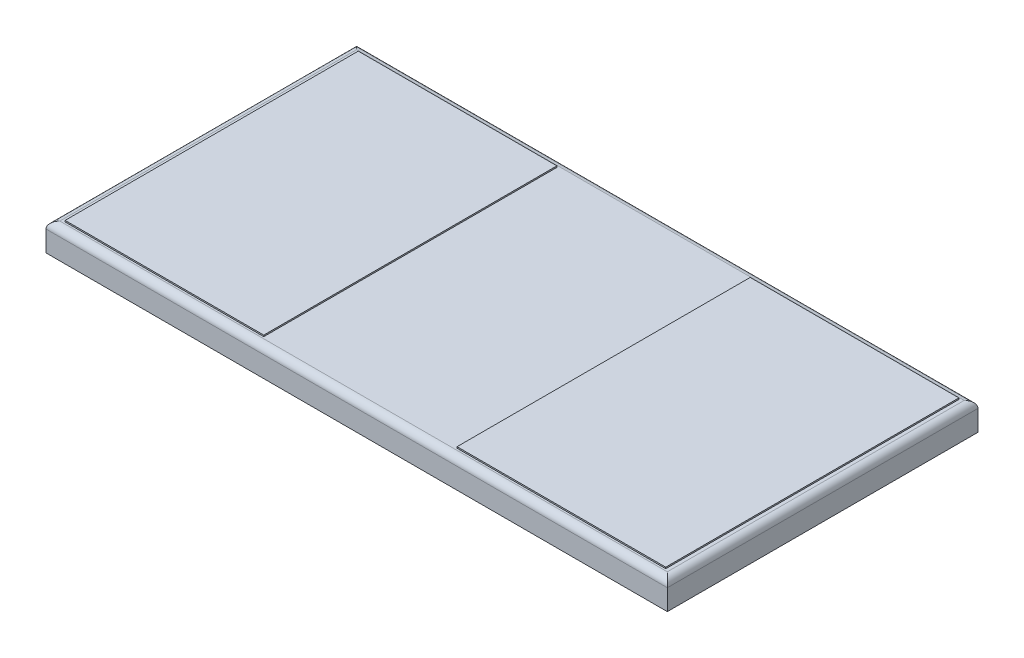
ISO-10303-21;
HEADER;
FILE_DESCRIPTION(('STEP AP214'),'2;1');
FILE_NAME('part.step','',(''),(''),'','','');
FILE_SCHEMA(('AUTOMOTIVE_DESIGN { 1 0 10303 214 1 1 1 1 }'));
ENDSEC;
DATA;
#1=APPLICATION_CONTEXT('core data for automotive mechanical design processes');
#2=APPLICATION_PROTOCOL_DEFINITION('international standard','automotive_design',2000,#1);
#3=PRODUCT_CONTEXT('',#1,'mechanical');
#4=PRODUCT('Part','Part','',(#3));
#5=PRODUCT_RELATED_PRODUCT_CATEGORY('part','',(#4));
#6=PRODUCT_DEFINITION_FORMATION('','',#4);
#7=PRODUCT_DEFINITION_CONTEXT('part definition',#1,'design');
#8=PRODUCT_DEFINITION('design','',#6,#7);
#9=PRODUCT_DEFINITION_SHAPE('','',#8);
#10=(LENGTH_UNIT() NAMED_UNIT(*) SI_UNIT(.MILLI.,.METRE.));
#11=(NAMED_UNIT(*) PLANE_ANGLE_UNIT() SI_UNIT($,.RADIAN.));
#12=(NAMED_UNIT(*) SI_UNIT($,.STERADIAN.) SOLID_ANGLE_UNIT());
#13=UNCERTAINTY_MEASURE_WITH_UNIT(LENGTH_MEASURE(1.E-05),#10,'distance_accuracy_value','');
#14=(GEOMETRIC_REPRESENTATION_CONTEXT(3) GLOBAL_UNCERTAINTY_ASSIGNED_CONTEXT((#13)) GLOBAL_UNIT_ASSIGNED_CONTEXT((#10,
#11,#12)) REPRESENTATION_CONTEXT('',''));
#15=CARTESIAN_POINT('',(0.,0.,0.));
#16=DIRECTION('',(0.,0.,1.));
#17=DIRECTION('',(1.,0.,0.));
#18=AXIS2_PLACEMENT_3D('',#15,#16,#17);
#19=CARTESIAN_POINT('',(0.,101.6,0.));
#20=DIRECTION('',(1.,0.,0.));
#21=DIRECTION('',(0.,0.,-1.));
#22=AXIS2_PLACEMENT_3D('',#19,#20,#21);
#23=PLANE('',#22);
#24=DIRECTION('',(0.,-1.,0.));
#25=VECTOR('',#24,1.);
#26=CARTESIAN_POINT('',(0.,101.6,0.));
#27=LINE('',#26,#25);
#28=CARTESIAN_POINT('',(0.,76.2,0.));
#29=VERTEX_POINT('',#28);
#30=CARTESIAN_POINT('',(0.,0.,0.));
#31=VERTEX_POINT('',#30);
#32=EDGE_CURVE('E257',#29,#31,#27,.T.);
#33=ORIENTED_EDGE('',*,*,#32,.F.);
#34=DIRECTION('',(0.,0.,1.));
#35=VECTOR('',#34,1.);
#36=CARTESIAN_POINT('',(0.,76.2,0.));
#37=LINE('',#36,#35);
#38=CARTESIAN_POINT('',(0.,76.2,-1143.));
#39=VERTEX_POINT('',#38);
#40=EDGE_CURVE('E11',#29,#39,#37,.F.);
#41=ORIENTED_EDGE('',*,*,#40,.T.);
#42=DIRECTION('',(0.,-1.,0.));
#43=VECTOR('',#42,1.);
#44=CARTESIAN_POINT('',(0.,101.6,-1143.));
#45=LINE('',#44,#43);
#46=CARTESIAN_POINT('',(0.,0.,-1143.));
#47=VERTEX_POINT('',#46);
#48=EDGE_CURVE('E248',#39,#47,#45,.T.);
#49=ORIENTED_EDGE('',*,*,#48,.T.);
#50=DIRECTION('',(0.,0.,1.));
#51=VECTOR('',#50,1.);
#52=CARTESIAN_POINT('',(0.,0.,0.));
#53=LINE('',#52,#51);
#54=EDGE_CURVE('E220',#47,#31,#53,.T.);
#55=ORIENTED_EDGE('',*,*,#54,.T.);
#56=EDGE_LOOP('',(#33,#41,#49,#55));
#57=FACE_BOUND('',#56,.T.);
#58=ADVANCED_FACE('F39',(#57),#23,.F.);
#59=CARTESIAN_POINT('',(0.,101.6,0.));
#60=DIRECTION('',(0.,0.,-1.));
#61=DIRECTION('',(-1.,0.,0.));
#62=AXIS2_PLACEMENT_3D('',#59,#60,#61);
#63=PLANE('',#62);
#64=DIRECTION('',(0.,-1.,0.));
#65=VECTOR('',#64,1.);
#66=CARTESIAN_POINT('',(2286.,101.6,0.));
#67=LINE('',#66,#65);
#68=CARTESIAN_POINT('',(2286.,76.2,0.));
#69=VERTEX_POINT('',#68);
#70=CARTESIAN_POINT('',(2286.,0.,0.));
#71=VERTEX_POINT('',#70);
#72=EDGE_CURVE('E254',#69,#71,#67,.T.);
#73=ORIENTED_EDGE('',*,*,#72,.F.);
#74=DIRECTION('',(1.,0.,0.));
#75=VECTOR('',#74,1.);
#76=CARTESIAN_POINT('',(0.,76.2,0.));
#77=LINE('',#76,#75);
#78=EDGE_CURVE('E273',#69,#29,#77,.F.);
#79=ORIENTED_EDGE('',*,*,#78,.T.);
#80=ORIENTED_EDGE('',*,*,#32,.T.);
#81=DIRECTION('',(1.,0.,0.));
#82=VECTOR('',#81,1.);
#83=CARTESIAN_POINT('',(0.,0.,0.));
#84=LINE('',#83,#82);
#85=EDGE_CURVE('E236',#31,#71,#84,.T.);
#86=ORIENTED_EDGE('',*,*,#85,.T.);
#87=EDGE_LOOP('',(#73,#79,#80,#86));
#88=FACE_BOUND('',#87,.T.);
#89=ADVANCED_FACE('F310',(#88),#63,.F.);
#90=CARTESIAN_POINT('',(2286.,101.6,0.));
#91=DIRECTION('',(-1.,0.,0.));
#92=DIRECTION('',(0.,0.,1.));
#93=AXIS2_PLACEMENT_3D('',#90,#91,#92);
#94=PLANE('',#93);
#95=DIRECTION('',(0.,-1.,0.));
#96=VECTOR('',#95,1.);
#97=CARTESIAN_POINT('',(2286.,101.6,-1143.));
#98=LINE('',#97,#96);
#99=CARTESIAN_POINT('',(2286.,76.2,-1143.));
#100=VERTEX_POINT('',#99);
#101=CARTESIAN_POINT('',(2286.,0.,-1143.));
#102=VERTEX_POINT('',#101);
#103=EDGE_CURVE('E251',#100,#102,#98,.T.);
#104=ORIENTED_EDGE('',*,*,#103,.F.);
#105=DIRECTION('',(0.,0.,-1.));
#106=VECTOR('',#105,1.);
#107=CARTESIAN_POINT('',(2286.,76.2,0.));
#108=LINE('',#107,#106);
#109=EDGE_CURVE('E277',#100,#69,#108,.F.);
#110=ORIENTED_EDGE('',*,*,#109,.T.);
#111=ORIENTED_EDGE('',*,*,#72,.T.);
#112=DIRECTION('',(0.,0.,-1.));
#113=VECTOR('',#112,1.);
#114=CARTESIAN_POINT('',(2286.,0.,0.));
#115=LINE('',#114,#113);
#116=EDGE_CURVE('E240',#71,#102,#115,.T.);
#117=ORIENTED_EDGE('',*,*,#116,.T.);
#118=EDGE_LOOP('',(#104,#110,#111,#117));
#119=FACE_BOUND('',#118,.T.);
#120=ADVANCED_FACE('F307',(#119),#94,.F.);
#121=CARTESIAN_POINT('',(0.,101.6,-1143.));
#122=DIRECTION('',(0.,0.,1.));
#123=DIRECTION('',(1.,0.,0.));
#124=AXIS2_PLACEMENT_3D('',#121,#122,#123);
#125=PLANE('',#124);
#126=ORIENTED_EDGE('',*,*,#48,.F.);
#127=DIRECTION('',(-1.,0.,0.));
#128=VECTOR('',#127,1.);
#129=CARTESIAN_POINT('',(0.,76.2,-1143.));
#130=LINE('',#129,#128);
#131=EDGE_CURVE('E49',#39,#100,#130,.F.);
#132=ORIENTED_EDGE('',*,*,#131,.T.);
#133=ORIENTED_EDGE('',*,*,#103,.T.);
#134=DIRECTION('',(-1.,0.,0.));
#135=VECTOR('',#134,1.);
#136=CARTESIAN_POINT('',(0.,0.,-1143.));
#137=LINE('',#136,#135);
#138=EDGE_CURVE('E244',#102,#47,#137,.T.);
#139=ORIENTED_EDGE('',*,*,#138,.T.);
#140=EDGE_LOOP('',(#126,#132,#133,#139));
#141=FACE_BOUND('',#140,.T.);
#142=ADVANCED_FACE('F321',(#141),#125,.F.);
#143=CARTESIAN_POINT('',(0.,101.6,0.));
#144=DIRECTION('',(0.,-1.,0.));
#145=DIRECTION('',(0.,0.,-1.));
#146=AXIS2_PLACEMENT_3D('',#143,#144,#145);
#147=PLANE('',#146);
#148=DIRECTION('',(0.,0.,1.));
#149=VECTOR('',#148,1.);
#150=CARTESIAN_POINT('',(25.4,101.6,0.));
#151=LINE('',#150,#149);
#152=CARTESIAN_POINT('',(25.4,101.6,-1117.6));
#153=VERTEX_POINT('',#152);
#154=CARTESIAN_POINT('',(25.4,101.6,-25.4));
#155=VERTEX_POINT('',#154);
#156=EDGE_CURVE('E260',#153,#155,#151,.T.);
#157=ORIENTED_EDGE('',*,*,#156,.T.);
#158=DIRECTION('',(1.,0.,0.));
#159=VECTOR('',#158,1.);
#160=CARTESIAN_POINT('',(0.,101.6,-25.4));
#161=LINE('',#160,#159);
#162=CARTESIAN_POINT('',(2260.6,101.6,-25.4));
#163=VERTEX_POINT('',#162);
#164=EDGE_CURVE('E269',#155,#163,#161,.T.);
#165=ORIENTED_EDGE('',*,*,#164,.T.);
#166=DIRECTION('',(0.,0.,-1.));
#167=VECTOR('',#166,1.);
#168=CARTESIAN_POINT('',(2260.6,101.6,0.));
#169=LINE('',#168,#167);
#170=CARTESIAN_POINT('',(2260.6,101.6,-1117.6));
#171=VERTEX_POINT('',#170);
#172=EDGE_CURVE('E266',#163,#171,#169,.T.);
#173=ORIENTED_EDGE('',*,*,#172,.T.);
#174=DIRECTION('',(-1.,0.,0.));
#175=VECTOR('',#174,1.);
#176=CARTESIAN_POINT('',(0.,101.6,-1117.6));
#177=LINE('',#176,#175);
#178=EDGE_CURVE('E263',#171,#153,#177,.T.);
#179=ORIENTED_EDGE('',*,*,#178,.T.);
#180=EDGE_LOOP('',(#157,#165,#173,#179));
#181=FACE_BOUND('',#180,.T.);
#182=DIRECTION('',(1.,0.,0.));
#183=VECTOR('',#182,1.);
#184=CARTESIAN_POINT('',(38.1000000000001,101.6,-32.2150045393577));
#185=LINE('',#184,#183);
#186=CARTESIAN_POINT('',(38.1000000000001,101.6,-32.2150045393577));
#187=VERTEX_POINT('',#186);
#188=CARTESIAN_POINT('',(769.015860416158,101.6,-32.2150045393577));
#189=VERTEX_POINT('',#188);
#190=EDGE_CURVE('E207',#187,#189,#185,.T.);
#191=ORIENTED_EDGE('',*,*,#190,.F.);
#192=DIRECTION('',(0.,0.,1.));
#193=VECTOR('',#192,1.);
#194=CARTESIAN_POINT('',(38.1,101.6,-1110.72196302009));
#195=LINE('',#194,#193);
#196=CARTESIAN_POINT('',(38.1,101.6,-1110.72196302009));
#197=VERTEX_POINT('',#196);
#198=EDGE_CURVE('E203',#197,#187,#195,.T.);
#199=ORIENTED_EDGE('',*,*,#198,.F.);
#200=DIRECTION('',(-1.,0.,0.));
#201=VECTOR('',#200,1.);
#202=CARTESIAN_POINT('',(38.1,101.6,-1110.72196302009));
#203=LINE('',#202,#201);
#204=CARTESIAN_POINT('',(769.015860416158,101.6,-1110.72196302009));
#205=VERTEX_POINT('',#204);
#206=EDGE_CURVE('E216',#205,#197,#203,.T.);
#207=ORIENTED_EDGE('',*,*,#206,.F.);
#208=DIRECTION('',(0.,0.,-1.));
#209=VECTOR('',#208,1.);
#210=CARTESIAN_POINT('',(769.015860416158,101.6,-1110.72196302009));
#211=LINE('',#210,#209);
#212=EDGE_CURVE('E212',#189,#205,#211,.T.);
#213=ORIENTED_EDGE('',*,*,#212,.F.);
#214=EDGE_LOOP('',(#191,#199,#207,#213));
#215=FACE_BOUND('',#214,.T.);
#216=DIRECTION('',(1.,0.,0.));
#217=VECTOR('',#216,1.);
#218=CARTESIAN_POINT('',(1480.21586041616,101.6,-32.2150045393578));
#219=LINE('',#218,#217);
#220=CARTESIAN_POINT('',(1480.21586041616,101.6,-32.2150045393578));
#221=VERTEX_POINT('',#220);
#222=CARTESIAN_POINT('',(2247.9,101.6,-32.2150045393578));
#223=VERTEX_POINT('',#222);
#224=EDGE_CURVE('E223',#221,#223,#219,.T.);
#225=ORIENTED_EDGE('',*,*,#224,.F.);
#226=DIRECTION('',(0.,0.,1.));
#227=VECTOR('',#226,1.);
#228=CARTESIAN_POINT('',(1480.21586041616,101.6,-1110.72196302009));
#229=LINE('',#228,#227);
#230=CARTESIAN_POINT('',(1480.21586041616,101.6,-1110.72196302009));
#231=VERTEX_POINT('',#230);
#232=EDGE_CURVE('E166',#231,#221,#229,.T.);
#233=ORIENTED_EDGE('',*,*,#232,.F.);
#234=DIRECTION('',(-1.,0.,0.));
#235=VECTOR('',#234,1.);
#236=CARTESIAN_POINT('',(1480.21586041616,101.6,-1110.72196302009));
#237=LINE('',#236,#235);
#238=CARTESIAN_POINT('',(2247.9,101.6,-1110.72196302009));
#239=VERTEX_POINT('',#238);
#240=EDGE_CURVE('E208',#239,#231,#237,.T.);
#241=ORIENTED_EDGE('',*,*,#240,.F.);
#242=DIRECTION('',(0.,0.,-1.));
#243=VECTOR('',#242,1.);
#244=CARTESIAN_POINT('',(2247.9,101.6,-1110.72196302009));
#245=LINE('',#244,#243);
#246=EDGE_CURVE('E226',#223,#239,#245,.T.);
#247=ORIENTED_EDGE('',*,*,#246,.F.);
#248=EDGE_LOOP('',(#225,#233,#241,#247));
#249=FACE_BOUND('',#248,.T.);
#250=ADVANCED_FACE('F317',(#181,#215,#249),#147,.F.);
#251=CARTESIAN_POINT('',(0.,0.,0.));
#252=DIRECTION('',(0.,-1.,0.));
#253=DIRECTION('',(0.,0.,-1.));
#254=AXIS2_PLACEMENT_3D('',#251,#252,#253);
#255=PLANE('',#254);
#256=ORIENTED_EDGE('',*,*,#54,.F.);
#257=ORIENTED_EDGE('',*,*,#138,.F.);
#258=ORIENTED_EDGE('',*,*,#116,.F.);
#259=ORIENTED_EDGE('',*,*,#85,.F.);
#260=EDGE_LOOP('',(#256,#257,#258,#259));
#261=FACE_BOUND('',#260,.T.);
#262=ADVANCED_FACE('F320',(#261),#255,.T.);
#263=CARTESIAN_POINT('',(38.1,106.68,-1110.72196302009));
#264=DIRECTION('',(1.,0.,0.));
#265=DIRECTION('',(0.,0.,-1.));
#266=AXIS2_PLACEMENT_3D('',#263,#264,#265);
#267=PLANE('',#266);
#268=DIRECTION('',(0.,-1.,0.));
#269=VECTOR('',#268,1.);
#270=CARTESIAN_POINT('',(38.1,106.68,-1110.72196302009));
#271=LINE('',#270,#269);
#272=CARTESIAN_POINT('',(38.1,106.68,-1110.72196302009));
#273=VERTEX_POINT('',#272);
#274=EDGE_CURVE('E187',#273,#197,#271,.T.);
#275=ORIENTED_EDGE('',*,*,#274,.T.);
#276=ORIENTED_EDGE('',*,*,#198,.T.);
#277=DIRECTION('',(0.,-1.,0.));
#278=VECTOR('',#277,1.);
#279=CARTESIAN_POINT('',(38.1,106.68,-32.2150045393577));
#280=LINE('',#279,#278);
#281=CARTESIAN_POINT('',(38.1,106.68,-32.2150045393577));
#282=VERTEX_POINT('',#281);
#283=EDGE_CURVE('E199',#282,#187,#280,.T.);
#284=ORIENTED_EDGE('',*,*,#283,.F.);
#285=DIRECTION('',(0.,0.,1.));
#286=VECTOR('',#285,1.);
#287=CARTESIAN_POINT('',(38.1,106.68,-1110.72196302009));
#288=LINE('',#287,#286);
#289=EDGE_CURVE('E168',#273,#282,#288,.T.);
#290=ORIENTED_EDGE('',*,*,#289,.F.);
#291=EDGE_LOOP('',(#275,#276,#284,#290));
#292=FACE_BOUND('',#291,.T.);
#293=ADVANCED_FACE('F410',(#292),#267,.F.);
#294=CARTESIAN_POINT('',(38.1,106.68,-32.2150045393577));
#295=DIRECTION('',(0.,0.,-1.));
#296=DIRECTION('',(-1.,0.,0.));
#297=AXIS2_PLACEMENT_3D('',#294,#295,#296);
#298=PLANE('',#297);
#299=ORIENTED_EDGE('',*,*,#283,.T.);
#300=ORIENTED_EDGE('',*,*,#190,.T.);
#301=DIRECTION('',(0.,-1.,0.));
#302=VECTOR('',#301,1.);
#303=CARTESIAN_POINT('',(769.015860416158,106.68,-32.2150045393577));
#304=LINE('',#303,#302);
#305=CARTESIAN_POINT('',(769.015860416158,106.68,-32.2150045393577));
#306=VERTEX_POINT('',#305);
#307=EDGE_CURVE('E195',#306,#189,#304,.T.);
#308=ORIENTED_EDGE('',*,*,#307,.F.);
#309=DIRECTION('',(1.,0.,0.));
#310=VECTOR('',#309,1.);
#311=CARTESIAN_POINT('',(38.1,106.68,-32.2150045393577));
#312=LINE('',#311,#310);
#313=EDGE_CURVE('E173',#282,#306,#312,.T.);
#314=ORIENTED_EDGE('',*,*,#313,.F.);
#315=EDGE_LOOP('',(#299,#300,#308,#314));
#316=FACE_BOUND('',#315,.T.);
#317=ADVANCED_FACE('F417',(#316),#298,.F.);
#318=CARTESIAN_POINT('',(769.015860416158,106.68,-1110.72196302009));
#319=DIRECTION('',(-1.,0.,0.));
#320=DIRECTION('',(0.,0.,1.));
#321=AXIS2_PLACEMENT_3D('',#318,#319,#320);
#322=PLANE('',#321);
#323=ORIENTED_EDGE('',*,*,#307,.T.);
#324=ORIENTED_EDGE('',*,*,#212,.T.);
#325=DIRECTION('',(0.,-1.,0.));
#326=VECTOR('',#325,1.);
#327=CARTESIAN_POINT('',(769.015860416158,106.68,-1110.72196302009));
#328=LINE('',#327,#326);
#329=CARTESIAN_POINT('',(769.015860416158,106.68,-1110.72196302009));
#330=VERTEX_POINT('',#329);
#331=EDGE_CURVE('E191',#330,#205,#328,.T.);
#332=ORIENTED_EDGE('',*,*,#331,.F.);
#333=DIRECTION('',(0.,0.,-1.));
#334=VECTOR('',#333,1.);
#335=CARTESIAN_POINT('',(769.015860416158,106.68,-1110.72196302009));
#336=LINE('',#335,#334);
#337=EDGE_CURVE('E181',#306,#330,#336,.T.);
#338=ORIENTED_EDGE('',*,*,#337,.F.);
#339=EDGE_LOOP('',(#323,#324,#332,#338));
#340=FACE_BOUND('',#339,.T.);
#341=ADVANCED_FACE('F425',(#340),#322,.F.);
#342=CARTESIAN_POINT('',(38.1,106.68,-1110.72196302009));
#343=DIRECTION('',(0.,0.,1.));
#344=DIRECTION('',(1.,0.,0.));
#345=AXIS2_PLACEMENT_3D('',#342,#343,#344);
#346=PLANE('',#345);
#347=ORIENTED_EDGE('',*,*,#331,.T.);
#348=ORIENTED_EDGE('',*,*,#206,.T.);
#349=ORIENTED_EDGE('',*,*,#274,.F.);
#350=DIRECTION('',(-1.,0.,0.));
#351=VECTOR('',#350,1.);
#352=CARTESIAN_POINT('',(38.1,106.68,-1110.72196302009));
#353=LINE('',#352,#351);
#354=EDGE_CURVE('E184',#330,#273,#353,.T.);
#355=ORIENTED_EDGE('',*,*,#354,.F.);
#356=EDGE_LOOP('',(#347,#348,#349,#355));
#357=FACE_BOUND('',#356,.T.);
#358=ADVANCED_FACE('F433',(#357),#346,.F.);
#359=CARTESIAN_POINT('',(0.,106.68,0.));
#360=DIRECTION('',(0.,1.,0.));
#361=DIRECTION('',(0.,0.,1.));
#362=AXIS2_PLACEMENT_3D('',#359,#360,#361);
#363=PLANE('',#362);
#364=ORIENTED_EDGE('',*,*,#289,.T.);
#365=ORIENTED_EDGE('',*,*,#313,.T.);
#366=ORIENTED_EDGE('',*,*,#337,.T.);
#367=ORIENTED_EDGE('',*,*,#354,.T.);
#368=EDGE_LOOP('',(#364,#365,#366,#367));
#369=FACE_BOUND('',#368,.T.);
#370=ADVANCED_FACE('F441',(#369),#363,.T.);
#371=CARTESIAN_POINT('',(1480.21586041616,106.68,-1110.72196302009));
#372=DIRECTION('',(1.,0.,0.));
#373=DIRECTION('',(0.,0.,-1.));
#374=AXIS2_PLACEMENT_3D('',#371,#372,#373);
#375=PLANE('',#374);
#376=DIRECTION('',(0.,-1.,0.));
#377=VECTOR('',#376,1.);
#378=CARTESIAN_POINT('',(1480.21586041616,106.68,-1110.72196302009));
#379=LINE('',#378,#377);
#380=CARTESIAN_POINT('',(1480.21586041616,106.68,-1110.72196302009));
#381=VERTEX_POINT('',#380);
#382=EDGE_CURVE('E331',#381,#231,#379,.T.);
#383=ORIENTED_EDGE('',*,*,#382,.T.);
#384=ORIENTED_EDGE('',*,*,#232,.T.);
#385=DIRECTION('',(0.,-1.,0.));
#386=VECTOR('',#385,1.);
#387=CARTESIAN_POINT('',(1480.21586041616,106.68,-32.2150045393578));
#388=LINE('',#387,#386);
#389=CARTESIAN_POINT('',(1480.21586041616,106.68,-32.2150045393578));
#390=VERTEX_POINT('',#389);
#391=EDGE_CURVE('E146',#390,#221,#388,.T.);
#392=ORIENTED_EDGE('',*,*,#391,.F.);
#393=DIRECTION('',(0.,0.,1.));
#394=VECTOR('',#393,1.);
#395=CARTESIAN_POINT('',(1480.21586041616,106.68,-1110.72196302009));
#396=LINE('',#395,#394);
#397=EDGE_CURVE('E153',#381,#390,#396,.T.);
#398=ORIENTED_EDGE('',*,*,#397,.F.);
#399=EDGE_LOOP('',(#383,#384,#392,#398));
#400=FACE_BOUND('',#399,.T.);
#401=ADVANCED_FACE('F165',(#400),#375,.F.);
#402=CARTESIAN_POINT('',(1480.21586041616,106.68,-32.2150045393578));
#403=DIRECTION('',(0.,0.,-1.));
#404=DIRECTION('',(-1.,0.,0.));
#405=AXIS2_PLACEMENT_3D('',#402,#403,#404);
#406=PLANE('',#405);
#407=ORIENTED_EDGE('',*,*,#391,.T.);
#408=ORIENTED_EDGE('',*,*,#224,.T.);
#409=DIRECTION('',(0.,-1.,0.));
#410=VECTOR('',#409,1.);
#411=CARTESIAN_POINT('',(2247.9,106.68,-32.2150045393578));
#412=LINE('',#411,#410);
#413=CARTESIAN_POINT('',(2247.9,106.68,-32.2150045393578));
#414=VERTEX_POINT('',#413);
#415=EDGE_CURVE('E148',#414,#223,#412,.T.);
#416=ORIENTED_EDGE('',*,*,#415,.F.);
#417=DIRECTION('',(1.,0.,0.));
#418=VECTOR('',#417,1.);
#419=CARTESIAN_POINT('',(1480.21586041616,106.68,-32.2150045393578));
#420=LINE('',#419,#418);
#421=EDGE_CURVE('E141',#390,#414,#420,.T.);
#422=ORIENTED_EDGE('',*,*,#421,.F.);
#423=EDGE_LOOP('',(#407,#408,#416,#422));
#424=FACE_BOUND('',#423,.T.);
#425=ADVANCED_FACE('F143',(#424),#406,.F.);
#426=CARTESIAN_POINT('',(2247.9,106.68,-1110.72196302009));
#427=DIRECTION('',(-1.,0.,0.));
#428=DIRECTION('',(0.,0.,1.));
#429=AXIS2_PLACEMENT_3D('',#426,#427,#428);
#430=PLANE('',#429);
#431=ORIENTED_EDGE('',*,*,#415,.T.);
#432=ORIENTED_EDGE('',*,*,#246,.T.);
#433=DIRECTION('',(0.,-1.,0.));
#434=VECTOR('',#433,1.);
#435=CARTESIAN_POINT('',(2247.9,106.68,-1110.72196302009));
#436=LINE('',#435,#434);
#437=CARTESIAN_POINT('',(2247.9,106.68,-1110.72196302009));
#438=VERTEX_POINT('',#437);
#439=EDGE_CURVE('E175',#438,#239,#436,.T.);
#440=ORIENTED_EDGE('',*,*,#439,.F.);
#441=DIRECTION('',(0.,0.,-1.));
#442=VECTOR('',#441,1.);
#443=CARTESIAN_POINT('',(2247.9,106.68,-1110.72196302009));
#444=LINE('',#443,#442);
#445=EDGE_CURVE('E152',#414,#438,#444,.T.);
#446=ORIENTED_EDGE('',*,*,#445,.F.);
#447=EDGE_LOOP('',(#431,#432,#440,#446));
#448=FACE_BOUND('',#447,.T.);
#449=ADVANCED_FACE('F325',(#448),#430,.F.);
#450=CARTESIAN_POINT('',(1480.21586041616,106.68,-1110.72196302009));
#451=DIRECTION('',(0.,0.,1.));
#452=DIRECTION('',(1.,0.,0.));
#453=AXIS2_PLACEMENT_3D('',#450,#451,#452);
#454=PLANE('',#453);
#455=ORIENTED_EDGE('',*,*,#439,.T.);
#456=ORIENTED_EDGE('',*,*,#240,.T.);
#457=ORIENTED_EDGE('',*,*,#382,.F.);
#458=DIRECTION('',(-1.,0.,0.));
#459=VECTOR('',#458,1.);
#460=CARTESIAN_POINT('',(1480.21586041616,106.68,-1110.72196302009));
#461=LINE('',#460,#459);
#462=EDGE_CURVE('E158',#438,#381,#461,.T.);
#463=ORIENTED_EDGE('',*,*,#462,.F.);
#464=EDGE_LOOP('',(#455,#456,#457,#463));
#465=FACE_BOUND('',#464,.T.);
#466=ADVANCED_FACE('F337',(#465),#454,.F.);
#467=CARTESIAN_POINT('',(0.,106.68,0.));
#468=DIRECTION('',(0.,1.,0.));
#469=DIRECTION('',(0.,0.,1.));
#470=AXIS2_PLACEMENT_3D('',#467,#468,#469);
#471=PLANE('',#470);
#472=ORIENTED_EDGE('',*,*,#397,.T.);
#473=ORIENTED_EDGE('',*,*,#421,.T.);
#474=ORIENTED_EDGE('',*,*,#445,.T.);
#475=ORIENTED_EDGE('',*,*,#462,.T.);
#476=EDGE_LOOP('',(#472,#473,#474,#475));
#477=FACE_BOUND('',#476,.T.);
#478=ADVANCED_FACE('F156',(#477),#471,.T.);
#479=CARTESIAN_POINT('',(0.,76.2,-1117.6));
#480=DIRECTION('',(-1.,0.,0.));
#481=DIRECTION('',(0.,0.,1.));
#482=AXIS2_PLACEMENT_3D('',#479,#480,#481);
#483=CYLINDRICAL_SURFACE('',#482,25.4);
#484=CARTESIAN_POINT('',(2260.6,76.2,-1117.6));
#485=DIRECTION('',(-0.707106781186547,0.,-0.707106781186547));
#486=DIRECTION('',(-0.707106781186547,0.,0.707106781186547));
#487=AXIS2_PLACEMENT_3D('',#484,#485,#486);
#488=ELLIPSE('',#487,35.9210244842766,25.4);
#489=EDGE_CURVE('E287',#100,#171,#488,.F.);
#490=ORIENTED_EDGE('',*,*,#489,.F.);
#491=ORIENTED_EDGE('',*,*,#131,.F.);
#492=CARTESIAN_POINT('',(25.4,76.2,-1117.6));
#493=DIRECTION('',(-0.707106781186547,0.,0.707106781186547));
#494=DIRECTION('',(0.707106781186547,0.,0.707106781186547));
#495=AXIS2_PLACEMENT_3D('',#492,#493,#494);
#496=ELLIPSE('',#495,35.9210244842766,25.4);
#497=EDGE_CURVE('E43',#153,#39,#496,.T.);
#498=ORIENTED_EDGE('',*,*,#497,.F.);
#499=ORIENTED_EDGE('',*,*,#178,.F.);
#500=EDGE_LOOP('',(#490,#491,#498,#499));
#501=FACE_BOUND('',#500,.T.);
#502=ADVANCED_FACE('F41',(#501),#483,.T.);
#503=CARTESIAN_POINT('',(25.4,76.2,0.));
#504=DIRECTION('',(0.,0.,1.));
#505=DIRECTION('',(1.,0.,0.));
#506=AXIS2_PLACEMENT_3D('',#503,#504,#505);
#507=CYLINDRICAL_SURFACE('',#506,25.4);
#508=ORIENTED_EDGE('',*,*,#497,.T.);
#509=ORIENTED_EDGE('',*,*,#40,.F.);
#510=CARTESIAN_POINT('',(25.4,76.2,-25.4));
#511=DIRECTION('',(0.707106781186547,0.,0.707106781186547));
#512=DIRECTION('',(-0.707106781186547,0.,0.707106781186547));
#513=AXIS2_PLACEMENT_3D('',#510,#511,#512);
#514=ELLIPSE('',#513,35.9210244842766,25.4);
#515=EDGE_CURVE('E285',#155,#29,#514,.T.);
#516=ORIENTED_EDGE('',*,*,#515,.F.);
#517=ORIENTED_EDGE('',*,*,#156,.F.);
#518=EDGE_LOOP('',(#508,#509,#516,#517));
#519=FACE_BOUND('',#518,.T.);
#520=ADVANCED_FACE('F299',(#519),#507,.T.);
#521=CARTESIAN_POINT('',(2260.6,76.2,0.));
#522=DIRECTION('',(0.,0.,-1.));
#523=DIRECTION('',(-1.,0.,0.));
#524=AXIS2_PLACEMENT_3D('',#521,#522,#523);
#525=CYLINDRICAL_SURFACE('',#524,25.4);
#526=ORIENTED_EDGE('',*,*,#489,.T.);
#527=ORIENTED_EDGE('',*,*,#172,.F.);
#528=CARTESIAN_POINT('',(2260.6,76.2,-25.4));
#529=DIRECTION('',(0.707106781186547,0.,-0.707106781186547));
#530=DIRECTION('',(-0.707106781186547,0.,-0.707106781186547));
#531=AXIS2_PLACEMENT_3D('',#528,#529,#530);
#532=ELLIPSE('',#531,35.9210244842766,25.4);
#533=EDGE_CURVE('E282',#69,#163,#532,.F.);
#534=ORIENTED_EDGE('',*,*,#533,.F.);
#535=ORIENTED_EDGE('',*,*,#109,.F.);
#536=EDGE_LOOP('',(#526,#527,#534,#535));
#537=FACE_BOUND('',#536,.T.);
#538=ADVANCED_FACE('F304',(#537),#525,.T.);
#539=CARTESIAN_POINT('',(0.,76.2,-25.4));
#540=DIRECTION('',(1.,0.,0.));
#541=DIRECTION('',(0.,0.,-1.));
#542=AXIS2_PLACEMENT_3D('',#539,#540,#541);
#543=CYLINDRICAL_SURFACE('',#542,25.4);
#544=ORIENTED_EDGE('',*,*,#515,.T.);
#545=ORIENTED_EDGE('',*,*,#78,.F.);
#546=ORIENTED_EDGE('',*,*,#533,.T.);
#547=ORIENTED_EDGE('',*,*,#164,.F.);
#548=EDGE_LOOP('',(#544,#545,#546,#547));
#549=FACE_BOUND('',#548,.T.);
#550=ADVANCED_FACE('F314',(#549),#543,.T.);
#551=CLOSED_SHELL('',(#58,#89,#120,#142,#250,#262,#293,#317,#341,#358,#370,#401,#425,#449,#466,
#478,#502,#520,#538,#550));
#552=MANIFOLD_SOLID_BREP('B2',#551);
#553=ADVANCED_BREP_SHAPE_REPRESENTATION('',(#18,#552),#14);
#554=SHAPE_DEFINITION_REPRESENTATION(#9,#553);
ENDSEC;
END-ISO-10303-21;
